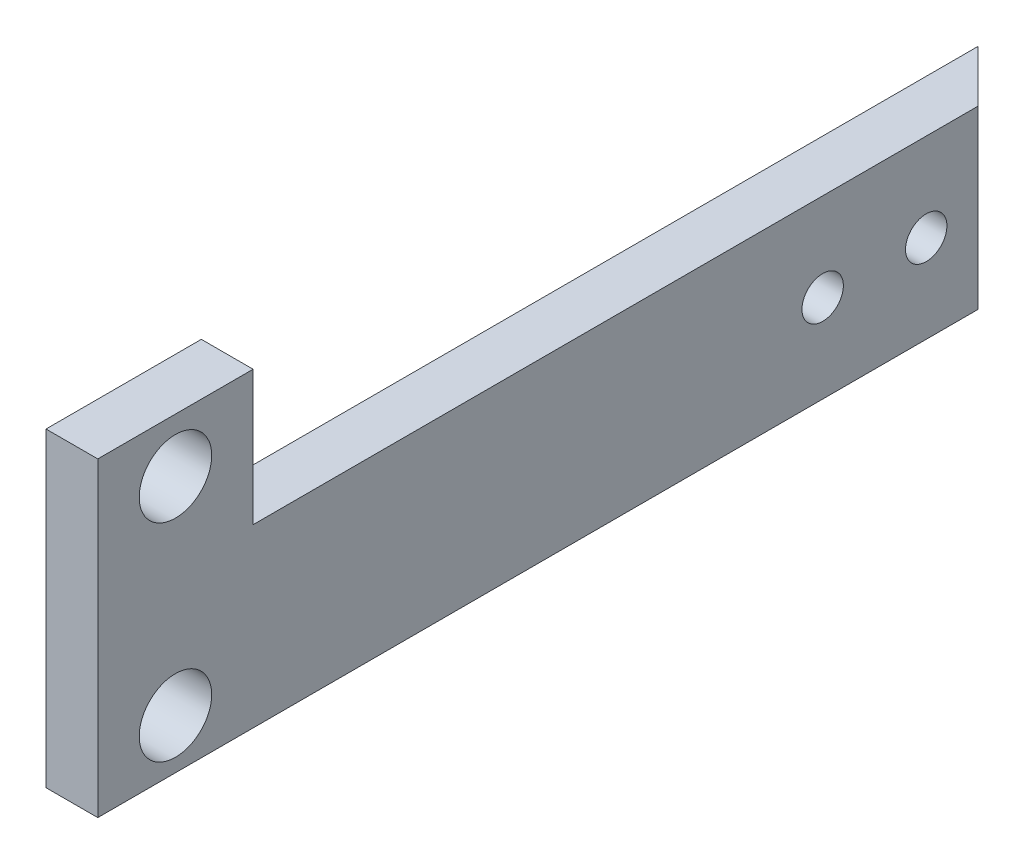
ISO-10303-21;
HEADER;
FILE_DESCRIPTION(('STEP AP214'),'2;1');
FILE_NAME('part.step','',(''),(''),'','','');
FILE_SCHEMA(('AUTOMOTIVE_DESIGN { 1 0 10303 214 1 1 1 1 }'));
ENDSEC;
DATA;
#1=APPLICATION_CONTEXT('core data for automotive mechanical design processes');
#2=APPLICATION_PROTOCOL_DEFINITION('international standard','automotive_design',2000,#1);
#3=PRODUCT_CONTEXT('',#1,'mechanical');
#4=PRODUCT('Part','Part','',(#3));
#5=PRODUCT_RELATED_PRODUCT_CATEGORY('part','',(#4));
#6=PRODUCT_DEFINITION_FORMATION('','',#4);
#7=PRODUCT_DEFINITION_CONTEXT('part definition',#1,'design');
#8=PRODUCT_DEFINITION('design','',#6,#7);
#9=PRODUCT_DEFINITION_SHAPE('','',#8);
#10=(LENGTH_UNIT() NAMED_UNIT(*) SI_UNIT(.MILLI.,.METRE.));
#11=(NAMED_UNIT(*) PLANE_ANGLE_UNIT() SI_UNIT($,.RADIAN.));
#12=(NAMED_UNIT(*) SI_UNIT($,.STERADIAN.) SOLID_ANGLE_UNIT());
#13=UNCERTAINTY_MEASURE_WITH_UNIT(LENGTH_MEASURE(1.E-05),#10,'distance_accuracy_value','');
#14=(GEOMETRIC_REPRESENTATION_CONTEXT(3) GLOBAL_UNCERTAINTY_ASSIGNED_CONTEXT((#13)) GLOBAL_UNIT_ASSIGNED_CONTEXT((#10,
#11,#12)) REPRESENTATION_CONTEXT('',''));
#15=CARTESIAN_POINT('',(0.,0.,0.));
#16=DIRECTION('',(0.,0.,1.));
#17=DIRECTION('',(1.,0.,0.));
#18=AXIS2_PLACEMENT_3D('',#15,#16,#17);
#19=CARTESIAN_POINT('',(2.5,-15.,15.));
#20=DIRECTION('',(-1.,0.,0.));
#21=DIRECTION('',(0.,0.,1.));
#22=AXIS2_PLACEMENT_3D('',#19,#20,#21);
#23=PLANE('',#22);
#24=CARTESIAN_POINT('',(2.5,-10.2049229860665,7.5));
#25=DIRECTION('',(1.,0.,0.));
#26=DIRECTION('',(0.,0.,-1.));
#27=AXIS2_PLACEMENT_3D('',#24,#25,#26);
#28=CIRCLE('',#27,3.5);
#29=CARTESIAN_POINT('',(2.5,-10.2049229860665,4.));
#30=VERTEX_POINT('',#29);
#31=EDGE_CURVE('E103',#30,#30,#28,.T.);
#32=ORIENTED_EDGE('',*,*,#31,.F.);
#33=EDGE_LOOP('',(#32));
#34=FACE_BOUND('',#33,.T.);
#35=CARTESIAN_POINT('',(2.5,9.79507701393345,7.5));
#36=DIRECTION('',(1.,0.,0.));
#37=DIRECTION('',(0.,0.,-1.));
#38=AXIS2_PLACEMENT_3D('',#35,#36,#37);
#39=CIRCLE('',#38,3.5);
#40=CARTESIAN_POINT('',(2.5,9.79507701393345,4.));
#41=VERTEX_POINT('',#40);
#42=EDGE_CURVE('E109',#41,#41,#39,.T.);
#43=ORIENTED_EDGE('',*,*,#42,.F.);
#44=EDGE_LOOP('',(#43));
#45=FACE_BOUND('',#44,.T.);
#46=CARTESIAN_POINT('',(2.5,-6.5,-65.));
#47=DIRECTION('',(-1.,0.,0.));
#48=DIRECTION('',(0.,0.,1.));
#49=AXIS2_PLACEMENT_3D('',#46,#47,#48);
#50=CIRCLE('',#49,2.00000000000001);
#51=CARTESIAN_POINT('',(2.5,-6.5,-63.));
#52=VERTEX_POINT('',#51);
#53=EDGE_CURVE('E176',#52,#52,#50,.T.);
#54=ORIENTED_EDGE('',*,*,#53,.T.);
#55=EDGE_LOOP('',(#54));
#56=FACE_BOUND('',#55,.T.);
#57=CARTESIAN_POINT('',(2.5,-6.5,-55.));
#58=DIRECTION('',(-1.,0.,0.));
#59=DIRECTION('',(0.,0.,1.));
#60=AXIS2_PLACEMENT_3D('',#57,#58,#59);
#61=CIRCLE('',#60,2.);
#62=CARTESIAN_POINT('',(2.5,-6.5,-53.));
#63=VERTEX_POINT('',#62);
#64=EDGE_CURVE('E105',#63,#63,#61,.T.);
#65=ORIENTED_EDGE('',*,*,#64,.T.);
#66=EDGE_LOOP('',(#65));
#67=FACE_BOUND('',#66,.T.);
#68=DIRECTION('',(0.,1.,0.));
#69=VECTOR('',#68,1.);
#70=CARTESIAN_POINT('',(2.5,-28.,-70.));
#71=LINE('',#70,#69);
#72=CARTESIAN_POINT('',(2.5,-15.,-70.));
#73=VERTEX_POINT('',#72);
#74=CARTESIAN_POINT('',(2.5,2.,-70.));
#75=VERTEX_POINT('',#74);
#76=EDGE_CURVE('E88',#73,#75,#71,.T.);
#77=ORIENTED_EDGE('',*,*,#76,.T.);
#78=DIRECTION('',(0.,0.,1.));
#79=VECTOR('',#78,1.);
#80=CARTESIAN_POINT('',(2.5,2.,-80.));
#81=LINE('',#80,#79);
#82=CARTESIAN_POINT('',(2.5,2.,0.));
#83=VERTEX_POINT('',#82);
#84=EDGE_CURVE('E94',#75,#83,#81,.T.);
#85=ORIENTED_EDGE('',*,*,#84,.T.);
#86=DIRECTION('',(0.,1.,0.));
#87=VECTOR('',#86,1.);
#88=CARTESIAN_POINT('',(2.5,-15.,0.));
#89=LINE('',#88,#87);
#90=CARTESIAN_POINT('',(2.5,15.,0.));
#91=VERTEX_POINT('',#90);
#92=EDGE_CURVE('E125',#83,#91,#89,.T.);
#93=ORIENTED_EDGE('',*,*,#92,.T.);
#94=DIRECTION('',(0.,0.,-1.));
#95=VECTOR('',#94,1.);
#96=CARTESIAN_POINT('',(2.5,15.,15.));
#97=LINE('',#96,#95);
#98=CARTESIAN_POINT('',(2.5,15.,15.));
#99=VERTEX_POINT('',#98);
#100=EDGE_CURVE('E11',#99,#91,#97,.T.);
#101=ORIENTED_EDGE('',*,*,#100,.F.);
#102=DIRECTION('',(0.,1.,0.));
#103=VECTOR('',#102,1.);
#104=CARTESIAN_POINT('',(2.5,-15.,15.));
#105=LINE('',#104,#103);
#106=CARTESIAN_POINT('',(2.5,-15.,15.));
#107=VERTEX_POINT('',#106);
#108=EDGE_CURVE('E115',#107,#99,#105,.T.);
#109=ORIENTED_EDGE('',*,*,#108,.F.);
#110=DIRECTION('',(0.,0.,-1.));
#111=VECTOR('',#110,1.);
#112=CARTESIAN_POINT('',(2.5,-15.,15.));
#113=LINE('',#112,#111);
#114=EDGE_CURVE('E98',#107,#73,#113,.T.);
#115=ORIENTED_EDGE('',*,*,#114,.T.);
#116=EDGE_LOOP('',(#77,#85,#93,#101,#109,#115));
#117=FACE_BOUND('',#116,.T.);
#118=ADVANCED_FACE('F33',(#34,#45,#56,#67,#117),#23,.F.);
#119=CARTESIAN_POINT('',(-2.5,-15.,15.));
#120=DIRECTION('',(1.,0.,0.));
#121=DIRECTION('',(0.,0.,-1.));
#122=AXIS2_PLACEMENT_3D('',#119,#120,#121);
#123=PLANE('',#122);
#124=CARTESIAN_POINT('',(-2.5,-10.2049229860665,7.5));
#125=DIRECTION('',(1.,0.,0.));
#126=DIRECTION('',(0.,0.,-1.));
#127=AXIS2_PLACEMENT_3D('',#124,#125,#126);
#128=CIRCLE('',#127,3.5);
#129=CARTESIAN_POINT('',(-2.5,-10.2049229860665,4.));
#130=VERTEX_POINT('',#129);
#131=EDGE_CURVE('E112',#130,#130,#128,.T.);
#132=ORIENTED_EDGE('',*,*,#131,.T.);
#133=EDGE_LOOP('',(#132));
#134=FACE_BOUND('',#133,.T.);
#135=CARTESIAN_POINT('',(-2.5,9.79507701393345,7.5));
#136=DIRECTION('',(1.,0.,0.));
#137=DIRECTION('',(0.,0.,-1.));
#138=AXIS2_PLACEMENT_3D('',#135,#136,#137);
#139=CIRCLE('',#138,3.5);
#140=CARTESIAN_POINT('',(-2.5,9.79507701393345,4.));
#141=VERTEX_POINT('',#140);
#142=EDGE_CURVE('E36',#141,#141,#139,.T.);
#143=ORIENTED_EDGE('',*,*,#142,.T.);
#144=EDGE_LOOP('',(#143));
#145=FACE_BOUND('',#144,.T.);
#146=CARTESIAN_POINT('',(-2.5,-6.5,-65.));
#147=DIRECTION('',(-1.,0.,0.));
#148=DIRECTION('',(0.,0.,1.));
#149=AXIS2_PLACEMENT_3D('',#146,#147,#148);
#150=CIRCLE('',#149,2.00000000000001);
#151=CARTESIAN_POINT('',(-2.5,-6.5,-63.));
#152=VERTEX_POINT('',#151);
#153=EDGE_CURVE('E183',#152,#152,#150,.T.);
#154=ORIENTED_EDGE('',*,*,#153,.F.);
#155=EDGE_LOOP('',(#154));
#156=FACE_BOUND('',#155,.T.);
#157=CARTESIAN_POINT('',(-2.5,-6.5,-55.));
#158=DIRECTION('',(-1.,0.,0.));
#159=DIRECTION('',(0.,0.,1.));
#160=AXIS2_PLACEMENT_3D('',#157,#158,#159);
#161=CIRCLE('',#160,2.);
#162=CARTESIAN_POINT('',(-2.5,-6.5,-53.));
#163=VERTEX_POINT('',#162);
#164=EDGE_CURVE('E180',#163,#163,#161,.T.);
#165=ORIENTED_EDGE('',*,*,#164,.F.);
#166=EDGE_LOOP('',(#165));
#167=FACE_BOUND('',#166,.T.);
#168=DIRECTION('',(0.,1.,0.));
#169=VECTOR('',#168,1.);
#170=CARTESIAN_POINT('',(-2.5,-28.,-75.));
#171=LINE('',#170,#169);
#172=CARTESIAN_POINT('',(-2.5,-15.,-75.));
#173=VERTEX_POINT('',#172);
#174=CARTESIAN_POINT('',(-2.5,2.,-75.));
#175=VERTEX_POINT('',#174);
#176=EDGE_CURVE('E49',#173,#175,#171,.T.);
#177=ORIENTED_EDGE('',*,*,#176,.F.);
#178=DIRECTION('',(0.,0.,-1.));
#179=VECTOR('',#178,1.);
#180=CARTESIAN_POINT('',(-2.5,-15.,15.));
#181=LINE('',#180,#179);
#182=CARTESIAN_POINT('',(-2.5,-15.,15.));
#183=VERTEX_POINT('',#182);
#184=EDGE_CURVE('E132',#183,#173,#181,.T.);
#185=ORIENTED_EDGE('',*,*,#184,.F.);
#186=DIRECTION('',(0.,-1.,0.));
#187=VECTOR('',#186,1.);
#188=CARTESIAN_POINT('',(-2.5,-15.,15.));
#189=LINE('',#188,#187);
#190=CARTESIAN_POINT('',(-2.5,15.,15.));
#191=VERTEX_POINT('',#190);
#192=EDGE_CURVE('E121',#191,#183,#189,.T.);
#193=ORIENTED_EDGE('',*,*,#192,.F.);
#194=DIRECTION('',(0.,0.,-1.));
#195=VECTOR('',#194,1.);
#196=CARTESIAN_POINT('',(-2.5,15.,15.));
#197=LINE('',#196,#195);
#198=CARTESIAN_POINT('',(-2.5,15.,0.));
#199=VERTEX_POINT('',#198);
#200=EDGE_CURVE('E41',#191,#199,#197,.T.);
#201=ORIENTED_EDGE('',*,*,#200,.T.);
#202=DIRECTION('',(0.,-1.,0.));
#203=VECTOR('',#202,1.);
#204=CARTESIAN_POINT('',(-2.5,-15.,0.));
#205=LINE('',#204,#203);
#206=CARTESIAN_POINT('',(-2.5,2.,0.));
#207=VERTEX_POINT('',#206);
#208=EDGE_CURVE('E119',#199,#207,#205,.T.);
#209=ORIENTED_EDGE('',*,*,#208,.T.);
#210=DIRECTION('',(0.,0.,1.));
#211=VECTOR('',#210,1.);
#212=CARTESIAN_POINT('',(-2.5,2.,-80.));
#213=LINE('',#212,#211);
#214=EDGE_CURVE('E56',#175,#207,#213,.T.);
#215=ORIENTED_EDGE('',*,*,#214,.F.);
#216=EDGE_LOOP('',(#177,#185,#193,#201,#209,#215));
#217=FACE_BOUND('',#216,.T.);
#218=ADVANCED_FACE('F142',(#134,#145,#156,#167,#217),#123,.F.);
#219=CARTESIAN_POINT('',(-2.5,-15.,15.));
#220=DIRECTION('',(0.,1.,0.));
#221=DIRECTION('',(0.,0.,1.));
#222=AXIS2_PLACEMENT_3D('',#219,#220,#221);
#223=PLANE('',#222);
#224=DIRECTION('',(-0.707106781186547,0.,-0.707106781186548));
#225=VECTOR('',#224,1.);
#226=CARTESIAN_POINT('',(42.5,-15.,-30.));
#227=LINE('',#226,#225);
#228=EDGE_CURVE('E186',#73,#173,#227,.T.);
#229=ORIENTED_EDGE('',*,*,#228,.F.);
#230=ORIENTED_EDGE('',*,*,#114,.F.);
#231=DIRECTION('',(1.,0.,0.));
#232=VECTOR('',#231,1.);
#233=CARTESIAN_POINT('',(-2.5,-15.,15.));
#234=LINE('',#233,#232);
#235=EDGE_CURVE('E123',#183,#107,#234,.T.);
#236=ORIENTED_EDGE('',*,*,#235,.F.);
#237=ORIENTED_EDGE('',*,*,#184,.T.);
#238=EDGE_LOOP('',(#229,#230,#236,#237));
#239=FACE_BOUND('',#238,.T.);
#240=ADVANCED_FACE('F167',(#239),#223,.F.);
#241=CARTESIAN_POINT('',(2.5,2.,-80.));
#242=DIRECTION('',(0.,-1.,0.));
#243=DIRECTION('',(0.,0.,-1.));
#244=AXIS2_PLACEMENT_3D('',#241,#242,#243);
#245=PLANE('',#244);
#246=DIRECTION('',(-0.707106781186547,0.,-0.707106781186548));
#247=VECTOR('',#246,1.);
#248=CARTESIAN_POINT('',(36.25,2.,-36.25));
#249=LINE('',#248,#247);
#250=EDGE_CURVE('E85',#75,#175,#249,.T.);
#251=ORIENTED_EDGE('',*,*,#250,.T.);
#252=ORIENTED_EDGE('',*,*,#214,.T.);
#253=DIRECTION('',(1.,0.,0.));
#254=VECTOR('',#253,1.);
#255=CARTESIAN_POINT('',(2.5,2.,0.));
#256=LINE('',#255,#254);
#257=EDGE_CURVE('E101',#207,#83,#256,.T.);
#258=ORIENTED_EDGE('',*,*,#257,.T.);
#259=ORIENTED_EDGE('',*,*,#84,.F.);
#260=EDGE_LOOP('',(#251,#252,#258,#259));
#261=FACE_BOUND('',#260,.T.);
#262=ADVANCED_FACE('F100',(#261),#245,.F.);
#263=CARTESIAN_POINT('',(-2.5,15.,15.));
#264=DIRECTION('',(0.,-1.,0.));
#265=DIRECTION('',(0.,0.,-1.));
#266=AXIS2_PLACEMENT_3D('',#263,#264,#265);
#267=PLANE('',#266);
#268=DIRECTION('',(-1.,0.,0.));
#269=VECTOR('',#268,1.);
#270=CARTESIAN_POINT('',(-2.5,15.,0.));
#271=LINE('',#270,#269);
#272=EDGE_CURVE('E127',#91,#199,#271,.T.);
#273=ORIENTED_EDGE('',*,*,#272,.T.);
#274=ORIENTED_EDGE('',*,*,#200,.F.);
#275=DIRECTION('',(-1.,0.,0.));
#276=VECTOR('',#275,1.);
#277=CARTESIAN_POINT('',(-2.5,15.,15.));
#278=LINE('',#277,#276);
#279=EDGE_CURVE('E118',#99,#191,#278,.T.);
#280=ORIENTED_EDGE('',*,*,#279,.F.);
#281=ORIENTED_EDGE('',*,*,#100,.T.);
#282=EDGE_LOOP('',(#273,#274,#280,#281));
#283=FACE_BOUND('',#282,.T.);
#284=ADVANCED_FACE('F203',(#283),#267,.F.);
#285=CARTESIAN_POINT('',(0.,0.,15.));
#286=DIRECTION('',(0.,0.,-1.));
#287=DIRECTION('',(-1.,0.,0.));
#288=AXIS2_PLACEMENT_3D('',#285,#286,#287);
#289=PLANE('',#288);
#290=ORIENTED_EDGE('',*,*,#108,.T.);
#291=ORIENTED_EDGE('',*,*,#279,.T.);
#292=ORIENTED_EDGE('',*,*,#192,.T.);
#293=ORIENTED_EDGE('',*,*,#235,.T.);
#294=EDGE_LOOP('',(#290,#291,#292,#293));
#295=FACE_BOUND('',#294,.T.);
#296=ADVANCED_FACE('F196',(#295),#289,.F.);
#297=CARTESIAN_POINT('',(0.,0.,0.));
#298=DIRECTION('',(0.,0.,-1.));
#299=DIRECTION('',(-1.,0.,0.));
#300=AXIS2_PLACEMENT_3D('',#297,#298,#299);
#301=PLANE('',#300);
#302=ORIENTED_EDGE('',*,*,#257,.F.);
#303=ORIENTED_EDGE('',*,*,#208,.F.);
#304=ORIENTED_EDGE('',*,*,#272,.F.);
#305=ORIENTED_EDGE('',*,*,#92,.F.);
#306=EDGE_LOOP('',(#302,#303,#304,#305));
#307=FACE_BOUND('',#306,.T.);
#308=ADVANCED_FACE('F158',(#307),#301,.T.);
#309=CARTESIAN_POINT('',(-12.5,-10.2049229860665,7.5));
#310=DIRECTION('',(1.,0.,0.));
#311=DIRECTION('',(0.,0.,-1.));
#312=AXIS2_PLACEMENT_3D('',#309,#310,#311);
#313=CYLINDRICAL_SURFACE('',#312,3.5);
#314=ORIENTED_EDGE('',*,*,#31,.T.);
#315=EDGE_LOOP('',(#314));
#316=FACE_BOUND('',#315,.T.);
#317=ORIENTED_EDGE('',*,*,#131,.F.);
#318=EDGE_LOOP('',(#317));
#319=FACE_BOUND('',#318,.T.);
#320=ADVANCED_FACE('F148',(#316,#319),#313,.F.);
#321=CARTESIAN_POINT('',(-12.5,9.79507701393345,7.5));
#322=DIRECTION('',(1.,0.,0.));
#323=DIRECTION('',(0.,0.,-1.));
#324=AXIS2_PLACEMENT_3D('',#321,#322,#323);
#325=CYLINDRICAL_SURFACE('',#324,3.5);
#326=ORIENTED_EDGE('',*,*,#42,.T.);
#327=EDGE_LOOP('',(#326));
#328=FACE_BOUND('',#327,.T.);
#329=ORIENTED_EDGE('',*,*,#142,.F.);
#330=EDGE_LOOP('',(#329));
#331=FACE_BOUND('',#330,.T.);
#332=ADVANCED_FACE('F145',(#328,#331),#325,.F.);
#333=CARTESIAN_POINT('',(7.5,-6.5,-65.));
#334=DIRECTION('',(-1.,0.,0.));
#335=DIRECTION('',(0.,0.,1.));
#336=AXIS2_PLACEMENT_3D('',#333,#334,#335);
#337=CYLINDRICAL_SURFACE('',#336,2.00000000000001);
#338=ORIENTED_EDGE('',*,*,#153,.T.);
#339=EDGE_LOOP('',(#338));
#340=FACE_BOUND('',#339,.T.);
#341=ORIENTED_EDGE('',*,*,#53,.F.);
#342=EDGE_LOOP('',(#341));
#343=FACE_BOUND('',#342,.T.);
#344=ADVANCED_FACE('F147',(#340,#343),#337,.F.);
#345=CARTESIAN_POINT('',(7.5,-6.5,-55.));
#346=DIRECTION('',(-1.,0.,0.));
#347=DIRECTION('',(0.,0.,1.));
#348=AXIS2_PLACEMENT_3D('',#345,#346,#347);
#349=CYLINDRICAL_SURFACE('',#348,2.);
#350=ORIENTED_EDGE('',*,*,#164,.T.);
#351=EDGE_LOOP('',(#350));
#352=FACE_BOUND('',#351,.T.);
#353=ORIENTED_EDGE('',*,*,#64,.F.);
#354=EDGE_LOOP('',(#353));
#355=FACE_BOUND('',#354,.T.);
#356=ADVANCED_FACE('F155',(#352,#355),#349,.F.);
#357=CARTESIAN_POINT('',(36.25,-28.,-36.25));
#358=DIRECTION('',(0.707106781186548,0.,-0.707106781186547));
#359=DIRECTION('',(-0.707106781186547,0.,-0.707106781186548));
#360=AXIS2_PLACEMENT_3D('',#357,#358,#359);
#361=PLANE('',#360);
#362=ORIENTED_EDGE('',*,*,#228,.T.);
#363=ORIENTED_EDGE('',*,*,#176,.T.);
#364=ORIENTED_EDGE('',*,*,#250,.F.);
#365=ORIENTED_EDGE('',*,*,#76,.F.);
#366=EDGE_LOOP('',(#362,#363,#364,#365));
#367=FACE_BOUND('',#366,.T.);
#368=ADVANCED_FACE('F87',(#367),#361,.T.);
#369=CLOSED_SHELL('',(#118,#218,#240,#262,#284,#296,#308,#320,#332,#344,#356,#368));
#370=MANIFOLD_SOLID_BREP('B2',#369);
#371=ADVANCED_BREP_SHAPE_REPRESENTATION('',(#18,#370),#14);
#372=SHAPE_DEFINITION_REPRESENTATION(#9,#371);
ENDSEC;
END-ISO-10303-21;
